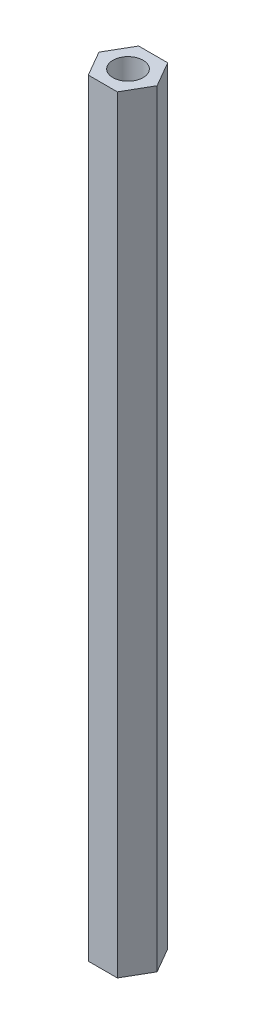
ISO-10303-21;
HEADER;
FILE_DESCRIPTION(('STEP AP214'),'2;1');
FILE_NAME('part.step','',(''),(''),'','','');
FILE_SCHEMA(('AUTOMOTIVE_DESIGN { 1 0 10303 214 1 1 1 1 }'));
ENDSEC;
DATA;
#1=APPLICATION_CONTEXT('core data for automotive mechanical design processes');
#2=APPLICATION_PROTOCOL_DEFINITION('international standard','automotive_design',2000,#1);
#3=PRODUCT_CONTEXT('',#1,'mechanical');
#4=PRODUCT('Part','Part','',(#3));
#5=PRODUCT_RELATED_PRODUCT_CATEGORY('part','',(#4));
#6=PRODUCT_DEFINITION_FORMATION('','',#4);
#7=PRODUCT_DEFINITION_CONTEXT('part definition',#1,'design');
#8=PRODUCT_DEFINITION('design','',#6,#7);
#9=PRODUCT_DEFINITION_SHAPE('','',#8);
#10=(LENGTH_UNIT() NAMED_UNIT(*) SI_UNIT(.MILLI.,.METRE.));
#11=(NAMED_UNIT(*) PLANE_ANGLE_UNIT() SI_UNIT($,.RADIAN.));
#12=(NAMED_UNIT(*) SI_UNIT($,.STERADIAN.) SOLID_ANGLE_UNIT());
#13=UNCERTAINTY_MEASURE_WITH_UNIT(LENGTH_MEASURE(1.E-05),#10,'distance_accuracy_value','');
#14=(GEOMETRIC_REPRESENTATION_CONTEXT(3) GLOBAL_UNCERTAINTY_ASSIGNED_CONTEXT((#13)) GLOBAL_UNIT_ASSIGNED_CONTEXT((#10,
#11,#12)) REPRESENTATION_CONTEXT('',''));
#15=CARTESIAN_POINT('',(0.,0.,0.));
#16=DIRECTION('',(0.,0.,1.));
#17=DIRECTION('',(1.,0.,0.));
#18=AXIS2_PLACEMENT_3D('',#15,#16,#17);
#19=CARTESIAN_POINT('',(1.44337567297408,76.2,2.49999999999999));
#20=DIRECTION('',(-0.86602540378444,0.,-0.499999999999998));
#21=DIRECTION('',(-0.499999999999998,0.,0.86602540378444));
#22=AXIS2_PLACEMENT_3D('',#19,#20,#21);
#23=PLANE('',#22);
#24=DIRECTION('',(0.499999999999998,0.,-0.86602540378444));
#25=VECTOR('',#24,1.);
#26=CARTESIAN_POINT('',(1.44337567297408,0.,2.49999999999999));
#27=LINE('',#26,#25);
#28=CARTESIAN_POINT('',(1.44337567297408,0.,2.49999999999999));
#29=VERTEX_POINT('',#28);
#30=CARTESIAN_POINT('',(2.88675134594811,0.,0.));
#31=VERTEX_POINT('',#30);
#32=EDGE_CURVE('E121',#29,#31,#27,.T.);
#33=ORIENTED_EDGE('',*,*,#32,.T.);
#34=DIRECTION('',(0.,-1.,0.));
#35=VECTOR('',#34,1.);
#36=CARTESIAN_POINT('',(2.88675134594811,76.2,0.));
#37=LINE('',#36,#35);
#38=CARTESIAN_POINT('',(2.88675134594811,76.2,0.));
#39=VERTEX_POINT('',#38);
#40=EDGE_CURVE('E11',#39,#31,#37,.T.);
#41=ORIENTED_EDGE('',*,*,#40,.F.);
#42=DIRECTION('',(0.499999999999998,0.,-0.86602540378444));
#43=VECTOR('',#42,1.);
#44=CARTESIAN_POINT('',(1.44337567297408,76.2,2.49999999999999));
#45=LINE('',#44,#43);
#46=CARTESIAN_POINT('',(1.44337567297408,76.2,2.49999999999999));
#47=VERTEX_POINT('',#46);
#48=EDGE_CURVE('E132',#47,#39,#45,.T.);
#49=ORIENTED_EDGE('',*,*,#48,.F.);
#50=DIRECTION('',(0.,-1.,0.));
#51=VECTOR('',#50,1.);
#52=CARTESIAN_POINT('',(1.44337567297408,76.2,2.49999999999999));
#53=LINE('',#52,#51);
#54=EDGE_CURVE('E117',#47,#29,#53,.T.);
#55=ORIENTED_EDGE('',*,*,#54,.T.);
#56=EDGE_LOOP('',(#33,#41,#49,#55));
#57=FACE_BOUND('',#56,.T.);
#58=ADVANCED_FACE('F37',(#57),#23,.F.);
#59=CARTESIAN_POINT('',(2.88675134594811,76.2,0.));
#60=DIRECTION('',(-0.86602540378444,0.,0.499999999999998));
#61=DIRECTION('',(0.499999999999998,0.,0.86602540378444));
#62=AXIS2_PLACEMENT_3D('',#59,#60,#61);
#63=PLANE('',#62);
#64=DIRECTION('',(-0.499999999999997,0.,-0.86602540378444));
#65=VECTOR('',#64,1.);
#66=CARTESIAN_POINT('',(2.88675134594811,0.,0.));
#67=LINE('',#66,#65);
#68=CARTESIAN_POINT('',(1.44337567297403,0.,-2.50000000000001));
#69=VERTEX_POINT('',#68);
#70=EDGE_CURVE('E124',#31,#69,#67,.T.);
#71=ORIENTED_EDGE('',*,*,#70,.T.);
#72=DIRECTION('',(0.,-1.,0.));
#73=VECTOR('',#72,1.);
#74=CARTESIAN_POINT('',(1.44337567297403,76.2,-2.50000000000001));
#75=LINE('',#74,#73);
#76=CARTESIAN_POINT('',(1.44337567297403,76.2,-2.50000000000001));
#77=VERTEX_POINT('',#76);
#78=EDGE_CURVE('E45',#77,#69,#75,.T.);
#79=ORIENTED_EDGE('',*,*,#78,.F.);
#80=DIRECTION('',(-0.499999999999997,0.,-0.86602540378444));
#81=VECTOR('',#80,1.);
#82=CARTESIAN_POINT('',(2.88675134594811,76.2,0.));
#83=LINE('',#82,#81);
#84=EDGE_CURVE('E90',#39,#77,#83,.T.);
#85=ORIENTED_EDGE('',*,*,#84,.F.);
#86=ORIENTED_EDGE('',*,*,#40,.T.);
#87=EDGE_LOOP('',(#71,#79,#85,#86));
#88=FACE_BOUND('',#87,.T.);
#89=ADVANCED_FACE('F157',(#88),#63,.F.);
#90=CARTESIAN_POINT('',(1.44337567297403,76.2,-2.50000000000001));
#91=DIRECTION('',(0.,0.,1.));
#92=DIRECTION('',(1.,0.,0.));
#93=AXIS2_PLACEMENT_3D('',#90,#91,#92);
#94=PLANE('',#93);
#95=DIRECTION('',(-1.,0.,0.));
#96=VECTOR('',#95,1.);
#97=CARTESIAN_POINT('',(1.44337567297403,0.,-2.50000000000001));
#98=LINE('',#97,#96);
#99=CARTESIAN_POINT('',(-1.44337567297408,0.,-2.5));
#100=VERTEX_POINT('',#99);
#101=EDGE_CURVE('E127',#69,#100,#98,.T.);
#102=ORIENTED_EDGE('',*,*,#101,.T.);
#103=DIRECTION('',(0.,-1.,0.));
#104=VECTOR('',#103,1.);
#105=CARTESIAN_POINT('',(-1.44337567297408,76.2,-2.5));
#106=LINE('',#105,#104);
#107=CARTESIAN_POINT('',(-1.44337567297408,76.2,-2.5));
#108=VERTEX_POINT('',#107);
#109=EDGE_CURVE('E112',#108,#100,#106,.T.);
#110=ORIENTED_EDGE('',*,*,#109,.F.);
#111=DIRECTION('',(-1.,0.,0.));
#112=VECTOR('',#111,1.);
#113=CARTESIAN_POINT('',(1.44337567297403,76.2,-2.50000000000001));
#114=LINE('',#113,#112);
#115=EDGE_CURVE('E103',#77,#108,#114,.T.);
#116=ORIENTED_EDGE('',*,*,#115,.F.);
#117=ORIENTED_EDGE('',*,*,#78,.T.);
#118=EDGE_LOOP('',(#102,#110,#116,#117));
#119=FACE_BOUND('',#118,.T.);
#120=ADVANCED_FACE('F138',(#119),#94,.F.);
#121=CARTESIAN_POINT('',(-1.44337567297408,76.2,-2.5));
#122=DIRECTION('',(0.866025403784438,0.,0.500000000000002));
#123=DIRECTION('',(0.500000000000002,0.,-0.866025403784438));
#124=AXIS2_PLACEMENT_3D('',#121,#122,#123);
#125=PLANE('',#124);
#126=DIRECTION('',(-0.500000000000002,0.,0.866025403784438));
#127=VECTOR('',#126,1.);
#128=CARTESIAN_POINT('',(-1.44337567297408,0.,-2.5));
#129=LINE('',#128,#127);
#130=CARTESIAN_POINT('',(-2.88675134594814,0.,0.));
#131=VERTEX_POINT('',#130);
#132=EDGE_CURVE('E111',#100,#131,#129,.T.);
#133=ORIENTED_EDGE('',*,*,#132,.T.);
#134=DIRECTION('',(0.,-1.,0.));
#135=VECTOR('',#134,1.);
#136=CARTESIAN_POINT('',(-2.88675134594814,76.2,0.));
#137=LINE('',#136,#135);
#138=CARTESIAN_POINT('',(-2.88675134594814,76.2,0.));
#139=VERTEX_POINT('',#138);
#140=EDGE_CURVE('E108',#139,#131,#137,.T.);
#141=ORIENTED_EDGE('',*,*,#140,.F.);
#142=DIRECTION('',(-0.500000000000002,0.,0.866025403784438));
#143=VECTOR('',#142,1.);
#144=CARTESIAN_POINT('',(-1.44337567297408,76.2,-2.5));
#145=LINE('',#144,#143);
#146=EDGE_CURVE('E97',#108,#139,#145,.T.);
#147=ORIENTED_EDGE('',*,*,#146,.F.);
#148=ORIENTED_EDGE('',*,*,#109,.T.);
#149=EDGE_LOOP('',(#133,#141,#147,#148));
#150=FACE_BOUND('',#149,.T.);
#151=ADVANCED_FACE('F109',(#150),#125,.F.);
#152=CARTESIAN_POINT('',(-2.88675134594814,76.2,0.));
#153=DIRECTION('',(0.866025403784437,0.,-0.500000000000002));
#154=DIRECTION('',(-0.500000000000002,0.,-0.866025403784438));
#155=AXIS2_PLACEMENT_3D('',#152,#153,#154);
#156=PLANE('',#155);
#157=DIRECTION('',(0.500000000000002,0.,0.866025403784438));
#158=VECTOR('',#157,1.);
#159=CARTESIAN_POINT('',(-2.88675134594814,0.,0.));
#160=LINE('',#159,#158);
#161=CARTESIAN_POINT('',(-1.44337567297406,0.,2.5));
#162=VERTEX_POINT('',#161);
#163=EDGE_CURVE('E76',#131,#162,#160,.T.);
#164=ORIENTED_EDGE('',*,*,#163,.T.);
#165=DIRECTION('',(0.,-1.,0.));
#166=VECTOR('',#165,1.);
#167=CARTESIAN_POINT('',(-1.44337567297406,76.2,2.5));
#168=LINE('',#167,#166);
#169=CARTESIAN_POINT('',(-1.44337567297406,76.2,2.5));
#170=VERTEX_POINT('',#169);
#171=EDGE_CURVE('E113',#170,#162,#168,.T.);
#172=ORIENTED_EDGE('',*,*,#171,.F.);
#173=DIRECTION('',(0.500000000000002,0.,0.866025403784438));
#174=VECTOR('',#173,1.);
#175=CARTESIAN_POINT('',(-2.88675134594814,76.2,0.));
#176=LINE('',#175,#174);
#177=EDGE_CURVE('E101',#139,#170,#176,.T.);
#178=ORIENTED_EDGE('',*,*,#177,.F.);
#179=ORIENTED_EDGE('',*,*,#140,.T.);
#180=EDGE_LOOP('',(#164,#172,#178,#179));
#181=FACE_BOUND('',#180,.T.);
#182=ADVANCED_FACE('F115',(#181),#156,.F.);
#183=CARTESIAN_POINT('',(-1.44337567297406,76.2,2.5));
#184=DIRECTION('',(0.,0.,-1.));
#185=DIRECTION('',(-1.,0.,0.));
#186=AXIS2_PLACEMENT_3D('',#183,#184,#185);
#187=PLANE('',#186);
#188=DIRECTION('',(1.,0.,0.));
#189=VECTOR('',#188,1.);
#190=CARTESIAN_POINT('',(-1.44337567297406,0.,2.5));
#191=LINE('',#190,#189);
#192=EDGE_CURVE('E82',#162,#29,#191,.T.);
#193=ORIENTED_EDGE('',*,*,#192,.T.);
#194=ORIENTED_EDGE('',*,*,#54,.F.);
#195=DIRECTION('',(1.,0.,0.));
#196=VECTOR('',#195,1.);
#197=CARTESIAN_POINT('',(-1.44337567297406,76.2,2.5));
#198=LINE('',#197,#196);
#199=EDGE_CURVE('E53',#170,#47,#198,.T.);
#200=ORIENTED_EDGE('',*,*,#199,.F.);
#201=ORIENTED_EDGE('',*,*,#171,.T.);
#202=EDGE_LOOP('',(#193,#194,#200,#201));
#203=FACE_BOUND('',#202,.T.);
#204=ADVANCED_FACE('F145',(#203),#187,.F.);
#205=CARTESIAN_POINT('',(0.,76.2,0.));
#206=DIRECTION('',(0.,1.,0.));
#207=DIRECTION('',(0.,0.,1.));
#208=AXIS2_PLACEMENT_3D('',#205,#206,#207);
#209=PLANE('',#208);
#210=CARTESIAN_POINT('',(0.,76.2,0.));
#211=DIRECTION('',(0.,1.,0.));
#212=DIRECTION('',(0.,0.,1.));
#213=AXIS2_PLACEMENT_3D('',#210,#211,#212);
#214=CIRCLE('',#213,1.5);
#215=CARTESIAN_POINT('',(0.,76.2,1.5));
#216=VERTEX_POINT('',#215);
#217=EDGE_CURVE('E244',#216,#216,#214,.T.);
#218=ORIENTED_EDGE('',*,*,#217,.F.);
#219=EDGE_LOOP('',(#218));
#220=FACE_BOUND('',#219,.T.);
#221=ORIENTED_EDGE('',*,*,#48,.T.);
#222=ORIENTED_EDGE('',*,*,#84,.T.);
#223=ORIENTED_EDGE('',*,*,#115,.T.);
#224=ORIENTED_EDGE('',*,*,#146,.T.);
#225=ORIENTED_EDGE('',*,*,#177,.T.);
#226=ORIENTED_EDGE('',*,*,#199,.T.);
#227=EDGE_LOOP('',(#221,#222,#223,#224,#225,#226));
#228=FACE_BOUND('',#227,.T.);
#229=ADVANCED_FACE('F99',(#220,#228),#209,.T.);
#230=CARTESIAN_POINT('',(0.,0.,0.));
#231=DIRECTION('',(0.,1.,0.));
#232=DIRECTION('',(0.,0.,1.));
#233=AXIS2_PLACEMENT_3D('',#230,#231,#232);
#234=PLANE('',#233);
#235=CARTESIAN_POINT('',(0.,0.,0.));
#236=DIRECTION('',(0.,1.,0.));
#237=DIRECTION('',(0.,0.,1.));
#238=AXIS2_PLACEMENT_3D('',#235,#236,#237);
#239=CIRCLE('',#238,1.5);
#240=CARTESIAN_POINT('',(0.,0.,1.5));
#241=VERTEX_POINT('',#240);
#242=EDGE_CURVE('E125',#241,#241,#239,.T.);
#243=ORIENTED_EDGE('',*,*,#242,.T.);
#244=EDGE_LOOP('',(#243));
#245=FACE_BOUND('',#244,.T.);
#246=ORIENTED_EDGE('',*,*,#32,.F.);
#247=ORIENTED_EDGE('',*,*,#192,.F.);
#248=ORIENTED_EDGE('',*,*,#163,.F.);
#249=ORIENTED_EDGE('',*,*,#132,.F.);
#250=ORIENTED_EDGE('',*,*,#101,.F.);
#251=ORIENTED_EDGE('',*,*,#70,.F.);
#252=EDGE_LOOP('',(#246,#247,#248,#249,#250,#251));
#253=FACE_BOUND('',#252,.T.);
#254=ADVANCED_FACE('F141',(#245,#253),#234,.F.);
#255=CARTESIAN_POINT('',(0.,0.,0.));
#256=DIRECTION('',(0.,1.,0.));
#257=DIRECTION('',(0.,0.,1.));
#258=AXIS2_PLACEMENT_3D('',#255,#256,#257);
#259=CYLINDRICAL_SURFACE('',#258,1.5);
#260=CARTESIAN_POINT('',(0.,0.,1.5));
#261=CARTESIAN_POINT('',(0.,0.79375,1.5));
#262=CARTESIAN_POINT('',(0.,1.5875,1.5));
#263=CARTESIAN_POINT('',(0.,3.175,1.5));
#264=CARTESIAN_POINT('',(0.,3.96875,1.5));
#265=CARTESIAN_POINT('',(0.,5.55625,1.5));
#266=CARTESIAN_POINT('',(0.,6.35,1.5));
#267=CARTESIAN_POINT('',(0.,7.9375,1.5));
#268=CARTESIAN_POINT('',(0.,8.73125,1.5));
#269=CARTESIAN_POINT('',(0.,10.31875,1.5));
#270=CARTESIAN_POINT('',(0.,11.1125,1.5));
#271=CARTESIAN_POINT('',(0.,12.7,1.5));
#272=CARTESIAN_POINT('',(0.,13.49375,1.5));
#273=CARTESIAN_POINT('',(0.,15.08125,1.5));
#274=CARTESIAN_POINT('',(0.,15.875,1.5));
#275=CARTESIAN_POINT('',(0.,17.4625,1.5));
#276=CARTESIAN_POINT('',(0.,18.25625,1.5));
#277=CARTESIAN_POINT('',(0.,19.84375,1.5));
#278=CARTESIAN_POINT('',(0.,20.6375,1.5));
#279=CARTESIAN_POINT('',(0.,22.225,1.5));
#280=CARTESIAN_POINT('',(0.,23.01875,1.5));
#281=CARTESIAN_POINT('',(0.,24.60625,1.5));
#282=CARTESIAN_POINT('',(0.,25.4,1.5));
#283=CARTESIAN_POINT('',(0.,26.9875,1.5));
#284=CARTESIAN_POINT('',(0.,27.78125,1.5));
#285=CARTESIAN_POINT('',(0.,29.36875,1.5));
#286=CARTESIAN_POINT('',(0.,30.1625,1.5));
#287=CARTESIAN_POINT('',(0.,31.75,1.5));
#288=CARTESIAN_POINT('',(0.,32.54375,1.5));
#289=CARTESIAN_POINT('',(0.,34.13125,1.5));
#290=CARTESIAN_POINT('',(0.,34.925,1.5));
#291=CARTESIAN_POINT('',(0.,36.5125,1.5));
#292=CARTESIAN_POINT('',(0.,37.30625,1.5));
#293=CARTESIAN_POINT('',(0.,38.89375,1.5));
#294=CARTESIAN_POINT('',(0.,39.6875,1.5));
#295=CARTESIAN_POINT('',(0.,41.275,1.5));
#296=CARTESIAN_POINT('',(0.,42.06875,1.5));
#297=CARTESIAN_POINT('',(0.,43.65625,1.5));
#298=CARTESIAN_POINT('',(0.,44.45,1.5));
#299=CARTESIAN_POINT('',(0.,46.0375,1.5));
#300=CARTESIAN_POINT('',(0.,46.83125,1.5));
#301=CARTESIAN_POINT('',(0.,48.41875,1.5));
#302=CARTESIAN_POINT('',(0.,49.2125,1.5));
#303=CARTESIAN_POINT('',(0.,50.8,1.5));
#304=CARTESIAN_POINT('',(0.,51.59375,1.5));
#305=CARTESIAN_POINT('',(0.,53.18125,1.5));
#306=CARTESIAN_POINT('',(0.,53.975,1.5));
#307=CARTESIAN_POINT('',(0.,55.5625,1.5));
#308=CARTESIAN_POINT('',(0.,56.35625,1.5));
#309=CARTESIAN_POINT('',(0.,57.94375,1.5));
#310=CARTESIAN_POINT('',(0.,58.7375,1.5));
#311=CARTESIAN_POINT('',(0.,60.325,1.5));
#312=CARTESIAN_POINT('',(0.,61.11875,1.5));
#313=CARTESIAN_POINT('',(0.,62.70625,1.5));
#314=CARTESIAN_POINT('',(0.,63.5,1.5));
#315=CARTESIAN_POINT('',(0.,65.0875,1.5));
#316=CARTESIAN_POINT('',(0.,65.88125,1.5));
#317=CARTESIAN_POINT('',(0.,67.46875,1.5));
#318=CARTESIAN_POINT('',(0.,68.2625,1.5));
#319=CARTESIAN_POINT('',(0.,69.85,1.5));
#320=CARTESIAN_POINT('',(0.,70.64375,1.5));
#321=CARTESIAN_POINT('',(0.,72.23125,1.5));
#322=CARTESIAN_POINT('',(0.,73.025,1.5));
#323=CARTESIAN_POINT('',(0.,74.6125,1.5));
#324=CARTESIAN_POINT('',(0.,75.40625,1.5));
#325=CARTESIAN_POINT('',(0.,76.2,1.5));
#326=B_SPLINE_CURVE_WITH_KNOTS('',3,(#260,#261,#262,#263,#264,#265,#266,#267,#268,#269,#270,
#271,#272,#273,#274,#275,#276,#277,#278,#279,#280,#281,#282,#283,#284,#285,#286,#287,#288,#289,
#290,#291,#292,#293,#294,#295,#296,#297,#298,#299,#300,#301,#302,#303,#304,#305,#306,#307,#308,
#309,#310,#311,#312,#313,#314,#315,#316,#317,#318,#319,#320,#321,#322,#323,#324,#325),
.UNSPECIFIED.,.F.,.F.,(4,2,2,2,2,2,2,2,2,2,2,2,2,2,2,2,2,2,2,2,2,2,2,2,2,2,2,2,2,2,2,2,4),(0.,
2.38125,4.7625,7.14375,9.525,11.90625,14.2875,16.66875,19.05,21.43125,23.8125,26.19375,28.575,
30.95625,33.3375,35.71875,38.1,40.48125,42.8625,45.24375,47.625,50.00625,52.3875,54.76875,57.15,
59.53125,61.9125,64.29375,66.675,69.05625,71.4375,73.81875,76.2),.UNSPECIFIED.);
#327=EDGE_CURVE('BSEAM197',#241,#216,#326,.T.);
#328=ORIENTED_EDGE('',*,*,#242,.F.);
#329=ORIENTED_EDGE('',*,*,#217,.T.);
#330=ORIENTED_EDGE('',*,*,#327,.T.);
#331=ORIENTED_EDGE('',*,*,#327,.F.);
#332=EDGE_LOOP('',(#328,#330,#329,#331));
#333=FACE_BOUND('',#332,.T.);
#334=ADVANCED_FACE('F197',(#333),#259,.F.);
#335=CLOSED_SHELL('',(#58,#89,#120,#151,#182,#204,#229,#254,#334));
#336=MANIFOLD_SOLID_BREP('B2',#335);
#337=ADVANCED_BREP_SHAPE_REPRESENTATION('',(#18,#336),#14);
#338=SHAPE_DEFINITION_REPRESENTATION(#9,#337);
ENDSEC;
END-ISO-10303-21;
